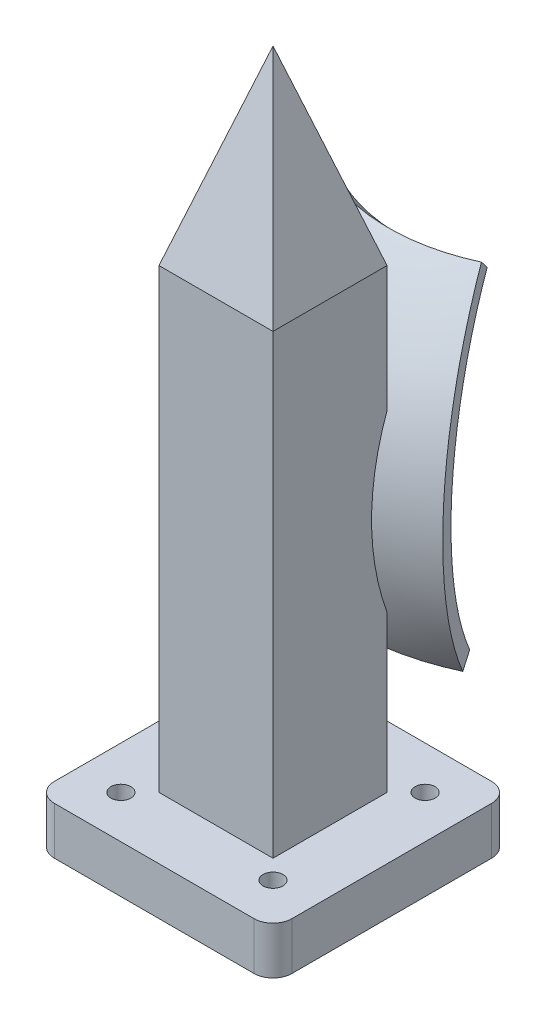
ISO-10303-21;
HEADER;
FILE_DESCRIPTION(('STEP AP214'),'2;1');
FILE_NAME('part.step','',(''),(''),'','','');
FILE_SCHEMA(('AUTOMOTIVE_DESIGN { 1 0 10303 214 1 1 1 1 }'));
ENDSEC;
DATA;
#1=APPLICATION_CONTEXT('core data for automotive mechanical design processes');
#2=APPLICATION_PROTOCOL_DEFINITION('international standard','automotive_design',2000,#1);
#3=PRODUCT_CONTEXT('',#1,'mechanical');
#4=PRODUCT('Part','Part','',(#3));
#5=PRODUCT_RELATED_PRODUCT_CATEGORY('part','',(#4));
#6=PRODUCT_DEFINITION_FORMATION('','',#4);
#7=PRODUCT_DEFINITION_CONTEXT('part definition',#1,'design');
#8=PRODUCT_DEFINITION('design','',#6,#7);
#9=PRODUCT_DEFINITION_SHAPE('','',#8);
#10=(LENGTH_UNIT() NAMED_UNIT(*) SI_UNIT(.MILLI.,.METRE.));
#11=(NAMED_UNIT(*) PLANE_ANGLE_UNIT() SI_UNIT($,.RADIAN.));
#12=(NAMED_UNIT(*) SI_UNIT($,.STERADIAN.) SOLID_ANGLE_UNIT());
#13=UNCERTAINTY_MEASURE_WITH_UNIT(LENGTH_MEASURE(1.E-05),#10,'distance_accuracy_value','');
#14=(GEOMETRIC_REPRESENTATION_CONTEXT(3) GLOBAL_UNCERTAINTY_ASSIGNED_CONTEXT((#13)) GLOBAL_UNIT_ASSIGNED_CONTEXT((#10,
#11,#12)) REPRESENTATION_CONTEXT('',''));
#15=CARTESIAN_POINT('',(0.,0.,0.));
#16=DIRECTION('',(0.,0.,1.));
#17=DIRECTION('',(1.,0.,0.));
#18=AXIS2_PLACEMENT_3D('',#15,#16,#17);
#19=CARTESIAN_POINT('',(18.5,53.,-6.5));
#20=DIRECTION('',(-1.,0.,0.));
#21=DIRECTION('',(0.,0.,1.));
#22=AXIS2_PLACEMENT_3D('',#19,#20,#21);
#23=PLANE('',#22);
#24=CARTESIAN_POINT('',(18.5,30.6059271862154,-43.6169817591008));
#25=DIRECTION('',(-1.,0.,0.));
#26=DIRECTION('',(0.,0.,1.));
#27=AXIS2_PLACEMENT_3D('',#24,#25,#26);
#28=CIRCLE('',#27,26.7452367752012);
#29=CARTESIAN_POINT('',(18.5,39.7953187588153,-18.5));
#30=VERTEX_POINT('',#29);
#31=CARTESIAN_POINT('',(18.5,21.4165356136154,-18.5));
#32=VERTEX_POINT('',#31);
#33=EDGE_CURVE('E77',#30,#32,#28,.F.);
#34=ORIENTED_EDGE('',*,*,#33,.F.);
#35=DIRECTION('',(0.,-1.,0.));
#36=VECTOR('',#35,1.);
#37=CARTESIAN_POINT('',(18.5,53.,-18.5));
#38=LINE('',#37,#36);
#39=CARTESIAN_POINT('',(18.5,53.,-18.5));
#40=VERTEX_POINT('',#39);
#41=EDGE_CURVE('E323',#40,#30,#38,.T.);
#42=ORIENTED_EDGE('',*,*,#41,.F.);
#43=DIRECTION('',(0.,0.,1.));
#44=VECTOR('',#43,1.);
#45=CARTESIAN_POINT('',(18.5,53.,-26.5));
#46=LINE('',#45,#44);
#47=CARTESIAN_POINT('',(18.5,53.,-6.5));
#48=VERTEX_POINT('',#47);
#49=EDGE_CURVE('E272',#40,#48,#46,.T.);
#50=ORIENTED_EDGE('',*,*,#49,.T.);
#51=DIRECTION('',(0.,-1.,0.));
#52=VECTOR('',#51,1.);
#53=CARTESIAN_POINT('',(18.5,53.,-6.5));
#54=LINE('',#53,#52);
#55=CARTESIAN_POINT('',(18.5,5.,-6.5));
#56=VERTEX_POINT('',#55);
#57=EDGE_CURVE('E325',#48,#56,#54,.T.);
#58=ORIENTED_EDGE('',*,*,#57,.T.);
#59=DIRECTION('',(0.,0.,-1.));
#60=VECTOR('',#59,1.);
#61=CARTESIAN_POINT('',(18.5,5.,-6.5));
#62=LINE('',#61,#60);
#63=CARTESIAN_POINT('',(18.5,5.,-18.5));
#64=VERTEX_POINT('',#63);
#65=EDGE_CURVE('E313',#56,#64,#62,.T.);
#66=ORIENTED_EDGE('',*,*,#65,.T.);
#67=EDGE_CURVE('E322',#32,#64,#38,.T.);
#68=ORIENTED_EDGE('',*,*,#67,.F.);
#69=EDGE_LOOP('',(#34,#42,#50,#58,#66,#68));
#70=FACE_BOUND('',#69,.T.);
#71=ADVANCED_FACE('F54',(#70),#23,.F.);
#72=CARTESIAN_POINT('',(6.5,53.,-18.5));
#73=DIRECTION('',(0.,0.,1.));
#74=DIRECTION('',(1.,0.,0.));
#75=AXIS2_PLACEMENT_3D('',#72,#73,#74);
#76=PLANE('',#75);
#77=CARTESIAN_POINT('',(12.5,30.6059271862154,-18.5));
#78=DIRECTION('',(0.,0.,1.));
#79=DIRECTION('',(1.,0.,0.));
#80=AXIS2_PLACEMENT_3D('',#77,#78,#79);
#81=CIRCLE('',#80,10.9747399729821);
#82=CARTESIAN_POINT('',(6.5,21.4165356136154,-18.5));
#83=VERTEX_POINT('',#82);
#84=EDGE_CURVE('E70',#32,#83,#81,.F.);
#85=ORIENTED_EDGE('',*,*,#84,.F.);
#86=ORIENTED_EDGE('',*,*,#67,.T.);
#87=DIRECTION('',(-1.,0.,0.));
#88=VECTOR('',#87,1.);
#89=CARTESIAN_POINT('',(6.5,5.,-18.5));
#90=LINE('',#89,#88);
#91=CARTESIAN_POINT('',(6.5,5.,-18.5));
#92=VERTEX_POINT('',#91);
#93=EDGE_CURVE('E316',#64,#92,#90,.T.);
#94=ORIENTED_EDGE('',*,*,#93,.T.);
#95=DIRECTION('',(0.,-1.,0.));
#96=VECTOR('',#95,1.);
#97=CARTESIAN_POINT('',(6.5,53.,-18.5));
#98=LINE('',#97,#96);
#99=EDGE_CURVE('E319',#83,#92,#98,.T.);
#100=ORIENTED_EDGE('',*,*,#99,.F.);
#101=EDGE_LOOP('',(#85,#86,#94,#100));
#102=FACE_BOUND('',#101,.T.);
#103=ADVANCED_FACE('F433',(#102),#76,.F.);
#104=CARTESIAN_POINT('',(6.5,39.7953187588153,-18.5));
#105=VERTEX_POINT('',#104);
#106=EDGE_CURVE('E220',#105,#30,#81,.F.);
#107=ORIENTED_EDGE('',*,*,#106,.F.);
#108=CARTESIAN_POINT('',(6.5,53.,-18.5));
#109=VERTEX_POINT('',#108);
#110=EDGE_CURVE('E320',#109,#105,#98,.T.);
#111=ORIENTED_EDGE('',*,*,#110,.F.);
#112=DIRECTION('',(-1.,0.,0.));
#113=VECTOR('',#112,1.);
#114=CARTESIAN_POINT('',(26.5,53.,-18.5));
#115=LINE('',#114,#113);
#116=EDGE_CURVE('E256',#40,#109,#115,.T.);
#117=ORIENTED_EDGE('',*,*,#116,.F.);
#118=ORIENTED_EDGE('',*,*,#41,.T.);
#119=EDGE_LOOP('',(#107,#111,#117,#118));
#120=FACE_BOUND('',#119,.T.);
#121=ADVANCED_FACE('F438',(#120),#76,.F.);
#122=CARTESIAN_POINT('',(6.5,53.,-6.5));
#123=DIRECTION('',(1.,0.,0.));
#124=DIRECTION('',(0.,0.,-1.));
#125=AXIS2_PLACEMENT_3D('',#122,#123,#124);
#126=PLANE('',#125);
#127=CARTESIAN_POINT('',(6.5,30.6059271862154,-43.6169817591008));
#128=DIRECTION('',(1.,0.,0.));
#129=DIRECTION('',(0.,0.,-1.));
#130=AXIS2_PLACEMENT_3D('',#127,#128,#129);
#131=CIRCLE('',#130,26.7452367752012);
#132=EDGE_CURVE('E12',#83,#105,#131,.F.);
#133=ORIENTED_EDGE('',*,*,#132,.F.);
#134=ORIENTED_EDGE('',*,*,#99,.T.);
#135=DIRECTION('',(0.,0.,1.));
#136=VECTOR('',#135,1.);
#137=CARTESIAN_POINT('',(6.5,5.,-6.5));
#138=LINE('',#137,#136);
#139=CARTESIAN_POINT('',(6.5,5.,-6.5));
#140=VERTEX_POINT('',#139);
#141=EDGE_CURVE('E307',#92,#140,#138,.T.);
#142=ORIENTED_EDGE('',*,*,#141,.T.);
#143=DIRECTION('',(0.,-1.,0.));
#144=VECTOR('',#143,1.);
#145=CARTESIAN_POINT('',(6.5,53.,-6.5));
#146=LINE('',#145,#144);
#147=CARTESIAN_POINT('',(6.5,53.,-6.5));
#148=VERTEX_POINT('',#147);
#149=EDGE_CURVE('E327',#148,#140,#146,.T.);
#150=ORIENTED_EDGE('',*,*,#149,.F.);
#151=DIRECTION('',(0.,0.,1.));
#152=VECTOR('',#151,1.);
#153=CARTESIAN_POINT('',(6.5,53.,-26.5));
#154=LINE('',#153,#152);
#155=EDGE_CURVE('E269',#109,#148,#154,.T.);
#156=ORIENTED_EDGE('',*,*,#155,.F.);
#157=ORIENTED_EDGE('',*,*,#110,.T.);
#158=EDGE_LOOP('',(#133,#134,#142,#150,#156,#157));
#159=FACE_BOUND('',#158,.T.);
#160=ADVANCED_FACE('F427',(#159),#126,.F.);
#161=CARTESIAN_POINT('',(6.5,53.,-6.5));
#162=DIRECTION('',(0.,0.,-1.));
#163=DIRECTION('',(-1.,0.,0.));
#164=AXIS2_PLACEMENT_3D('',#161,#162,#163);
#165=PLANE('',#164);
#166=DIRECTION('',(-1.,0.,0.));
#167=VECTOR('',#166,1.);
#168=CARTESIAN_POINT('',(26.5,53.,-6.5));
#169=LINE('',#168,#167);
#170=EDGE_CURVE('E263',#48,#148,#169,.T.);
#171=ORIENTED_EDGE('',*,*,#170,.T.);
#172=ORIENTED_EDGE('',*,*,#149,.T.);
#173=DIRECTION('',(1.,0.,0.));
#174=VECTOR('',#173,1.);
#175=CARTESIAN_POINT('',(6.5,5.,-6.5));
#176=LINE('',#175,#174);
#177=EDGE_CURVE('E310',#140,#56,#176,.T.);
#178=ORIENTED_EDGE('',*,*,#177,.T.);
#179=ORIENTED_EDGE('',*,*,#57,.F.);
#180=EDGE_LOOP('',(#171,#172,#178,#179));
#181=FACE_BOUND('',#180,.T.);
#182=ADVANCED_FACE('F420',(#181),#165,.F.);
#183=CARTESIAN_POINT('',(31.5596330275229,9.46788990825688,-26.5));
#184=DIRECTION('',(0.957826285221151,0.287347885566345,0.));
#185=DIRECTION('',(-0.287347885566345,0.957826285221151,0.));
#186=AXIS2_PLACEMENT_3D('',#183,#184,#185);
#187=PLANE('',#186);
#188=DIRECTION('',(0.276172385369497,-0.920574617898323,-0.276172385369497));
#189=VECTOR('',#188,1.);
#190=CARTESIAN_POINT('',(31.1737288135593,10.7542372881356,-31.1737288135593));
#191=LINE('',#190,#189);
#192=CARTESIAN_POINT('',(12.5,73.,-12.5));
#193=VERTEX_POINT('',#192);
#194=EDGE_CURVE('E261',#193,#40,#191,.T.);
#195=ORIENTED_EDGE('',*,*,#194,.F.);
#196=DIRECTION('',(0.276172385369497,-0.920574617898323,0.276172385369497));
#197=VECTOR('',#196,1.);
#198=CARTESIAN_POINT('',(29.0381355932203,17.8728813559322,4.03813559322033));
#199=LINE('',#198,#197);
#200=EDGE_CURVE('E266',#193,#48,#199,.T.);
#201=ORIENTED_EDGE('',*,*,#200,.T.);
#202=ORIENTED_EDGE('',*,*,#49,.F.);
#203=EDGE_LOOP('',(#195,#201,#202));
#204=FACE_BOUND('',#203,.T.);
#205=ADVANCED_FACE('F443',(#204),#187,.T.);
#206=CARTESIAN_POINT('',(-8.62385321100917,2.58715596330275,-26.5));
#207=DIRECTION('',(0.957826285221151,-0.287347885566345,0.));
#208=DIRECTION('',(0.287347885566345,0.957826285221151,0.));
#209=AXIS2_PLACEMENT_3D('',#206,#207,#208);
#210=PLANE('',#209);
#211=DIRECTION('',(-0.276172385369497,-0.920574617898323,0.276172385369497));
#212=VECTOR('',#211,1.);
#213=CARTESIAN_POINT('',(-5.94491525423728,11.5169491525424,5.94491525423728));
#214=LINE('',#213,#212);
#215=EDGE_CURVE('E63',#193,#148,#214,.T.);
#216=ORIENTED_EDGE('',*,*,#215,.F.);
#217=DIRECTION('',(-0.276172385369497,-0.920574617898323,-0.276172385369497));
#218=VECTOR('',#217,1.);
#219=CARTESIAN_POINT('',(-8.08050847457627,4.39830508474576,-33.0805084745763));
#220=LINE('',#219,#218);
#221=EDGE_CURVE('E258',#193,#109,#220,.T.);
#222=ORIENTED_EDGE('',*,*,#221,.T.);
#223=ORIENTED_EDGE('',*,*,#155,.T.);
#224=EDGE_LOOP('',(#216,#222,#223));
#225=FACE_BOUND('',#224,.T.);
#226=ADVANCED_FACE('F424',(#225),#210,.F.);
#227=CARTESIAN_POINT('',(0.,5.,0.));
#228=DIRECTION('',(0.,-1.,0.));
#229=DIRECTION('',(0.,0.,-1.));
#230=AXIS2_PLACEMENT_3D('',#227,#228,#229);
#231=PLANE('',#230);
#232=CARTESIAN_POINT('',(4.5,5.,-20.5));
#233=DIRECTION('',(0.,1.,0.));
#234=DIRECTION('',(0.,0.,1.));
#235=AXIS2_PLACEMENT_3D('',#232,#233,#234);
#236=CIRCLE('',#235,1.05);
#237=CARTESIAN_POINT('',(4.5,5.,-19.45));
#238=VERTEX_POINT('',#237);
#239=EDGE_CURVE('E329',#238,#238,#236,.T.);
#240=ORIENTED_EDGE('',*,*,#239,.F.);
#241=EDGE_LOOP('',(#240));
#242=FACE_BOUND('',#241,.T.);
#243=CARTESIAN_POINT('',(20.5,5.,-20.5));
#244=DIRECTION('',(0.,1.,0.));
#245=DIRECTION('',(0.,0.,1.));
#246=AXIS2_PLACEMENT_3D('',#243,#244,#245);
#247=CIRCLE('',#246,1.05);
#248=CARTESIAN_POINT('',(20.5,5.,-19.45));
#249=VERTEX_POINT('',#248);
#250=EDGE_CURVE('E333',#249,#249,#247,.T.);
#251=ORIENTED_EDGE('',*,*,#250,.F.);
#252=EDGE_LOOP('',(#251));
#253=FACE_BOUND('',#252,.T.);
#254=CARTESIAN_POINT('',(20.5,5.,-4.5));
#255=DIRECTION('',(0.,1.,0.));
#256=DIRECTION('',(0.,0.,1.));
#257=AXIS2_PLACEMENT_3D('',#254,#255,#256);
#258=CIRCLE('',#257,1.05);
#259=CARTESIAN_POINT('',(20.5,5.,-3.45));
#260=VERTEX_POINT('',#259);
#261=EDGE_CURVE('E339',#260,#260,#258,.T.);
#262=ORIENTED_EDGE('',*,*,#261,.F.);
#263=EDGE_LOOP('',(#262));
#264=FACE_BOUND('',#263,.T.);
#265=CARTESIAN_POINT('',(4.5,5.,-4.5));
#266=DIRECTION('',(0.,1.,0.));
#267=DIRECTION('',(0.,0.,1.));
#268=AXIS2_PLACEMENT_3D('',#265,#266,#267);
#269=CIRCLE('',#268,1.05);
#270=CARTESIAN_POINT('',(4.5,5.,-3.45));
#271=VERTEX_POINT('',#270);
#272=EDGE_CURVE('E345',#271,#271,#269,.T.);
#273=ORIENTED_EDGE('',*,*,#272,.F.);
#274=EDGE_LOOP('',(#273));
#275=FACE_BOUND('',#274,.T.);
#276=DIRECTION('',(-1.,0.,0.));
#277=VECTOR('',#276,1.);
#278=CARTESIAN_POINT('',(0.,5.,-25.));
#279=LINE('',#278,#277);
#280=CARTESIAN_POINT('',(23.,5.,-25.));
#281=VERTEX_POINT('',#280);
#282=CARTESIAN_POINT('',(2.,5.,-25.));
#283=VERTEX_POINT('',#282);
#284=EDGE_CURVE('E364',#281,#283,#279,.T.);
#285=ORIENTED_EDGE('',*,*,#284,.T.);
#286=CARTESIAN_POINT('',(2.,5.,-23.));
#287=DIRECTION('',(0.,-1.,0.));
#288=DIRECTION('',(0.,0.,-1.));
#289=AXIS2_PLACEMENT_3D('',#286,#287,#288);
#290=CIRCLE('',#289,2.);
#291=CARTESIAN_POINT('',(0.,5.,-23.));
#292=VERTEX_POINT('',#291);
#293=EDGE_CURVE('E401',#283,#292,#290,.F.);
#294=ORIENTED_EDGE('',*,*,#293,.T.);
#295=DIRECTION('',(0.,0.,1.));
#296=VECTOR('',#295,1.);
#297=CARTESIAN_POINT('',(0.,5.,0.));
#298=LINE('',#297,#296);
#299=CARTESIAN_POINT('',(0.,5.,-2.));
#300=VERTEX_POINT('',#299);
#301=EDGE_CURVE('E354',#292,#300,#298,.T.);
#302=ORIENTED_EDGE('',*,*,#301,.T.);
#303=CARTESIAN_POINT('',(2.,5.,-2.));
#304=DIRECTION('',(0.,-1.,0.));
#305=DIRECTION('',(0.,0.,-1.));
#306=AXIS2_PLACEMENT_3D('',#303,#304,#305);
#307=CIRCLE('',#306,2.);
#308=CARTESIAN_POINT('',(2.,5.,0.));
#309=VERTEX_POINT('',#308);
#310=EDGE_CURVE('E399',#300,#309,#307,.F.);
#311=ORIENTED_EDGE('',*,*,#310,.T.);
#312=DIRECTION('',(1.,0.,0.));
#313=VECTOR('',#312,1.);
#314=CARTESIAN_POINT('',(0.,5.,0.));
#315=LINE('',#314,#313);
#316=CARTESIAN_POINT('',(23.,5.,0.));
#317=VERTEX_POINT('',#316);
#318=EDGE_CURVE('E357',#309,#317,#315,.T.);
#319=ORIENTED_EDGE('',*,*,#318,.T.);
#320=CARTESIAN_POINT('',(23.,5.,-2.));
#321=DIRECTION('',(0.,-1.,0.));
#322=DIRECTION('',(0.,0.,-1.));
#323=AXIS2_PLACEMENT_3D('',#320,#321,#322);
#324=CIRCLE('',#323,2.);
#325=CARTESIAN_POINT('',(25.,5.,-2.));
#326=VERTEX_POINT('',#325);
#327=EDGE_CURVE('E395',#317,#326,#324,.F.);
#328=ORIENTED_EDGE('',*,*,#327,.T.);
#329=DIRECTION('',(0.,0.,-1.));
#330=VECTOR('',#329,1.);
#331=CARTESIAN_POINT('',(25.,5.,0.));
#332=LINE('',#331,#330);
#333=CARTESIAN_POINT('',(25.,5.,-23.));
#334=VERTEX_POINT('',#333);
#335=EDGE_CURVE('E361',#326,#334,#332,.T.);
#336=ORIENTED_EDGE('',*,*,#335,.T.);
#337=CARTESIAN_POINT('',(23.,5.,-23.));
#338=DIRECTION('',(0.,-1.,0.));
#339=DIRECTION('',(0.,0.,-1.));
#340=AXIS2_PLACEMENT_3D('',#337,#338,#339);
#341=CIRCLE('',#340,2.);
#342=EDGE_CURVE('E397',#334,#281,#341,.F.);
#343=ORIENTED_EDGE('',*,*,#342,.T.);
#344=EDGE_LOOP('',(#285,#294,#302,#311,#319,#328,#336,#343));
#345=FACE_BOUND('',#344,.T.);
#346=ORIENTED_EDGE('',*,*,#141,.F.);
#347=ORIENTED_EDGE('',*,*,#93,.F.);
#348=ORIENTED_EDGE('',*,*,#65,.F.);
#349=ORIENTED_EDGE('',*,*,#177,.F.);
#350=EDGE_LOOP('',(#346,#347,#348,#349));
#351=FACE_BOUND('',#350,.T.);
#352=ADVANCED_FACE('F431',(#242,#253,#264,#275,#345,#351),#231,.F.);
#353=CARTESIAN_POINT('',(0.,5.,0.));
#354=DIRECTION('',(1.,0.,0.));
#355=DIRECTION('',(0.,0.,-1.));
#356=AXIS2_PLACEMENT_3D('',#353,#354,#355);
#357=PLANE('',#356);
#358=ORIENTED_EDGE('',*,*,#301,.F.);
#359=DIRECTION('',(0.,-1.,0.));
#360=VECTOR('',#359,1.);
#361=CARTESIAN_POINT('',(0.,5.,-23.));
#362=LINE('',#361,#360);
#363=CARTESIAN_POINT('',(0.,0.,-23.));
#364=VERTEX_POINT('',#363);
#365=EDGE_CURVE('E379',#292,#364,#362,.T.);
#366=ORIENTED_EDGE('',*,*,#365,.T.);
#367=DIRECTION('',(0.,0.,1.));
#368=VECTOR('',#367,1.);
#369=CARTESIAN_POINT('',(0.,0.,0.));
#370=LINE('',#369,#368);
#371=CARTESIAN_POINT('',(0.,0.,-2.));
#372=VERTEX_POINT('',#371);
#373=EDGE_CURVE('E351',#364,#372,#370,.T.);
#374=ORIENTED_EDGE('',*,*,#373,.T.);
#375=DIRECTION('',(0.,-1.,0.));
#376=VECTOR('',#375,1.);
#377=CARTESIAN_POINT('',(0.,5.,-2.));
#378=LINE('',#377,#376);
#379=EDGE_CURVE('E367',#372,#300,#378,.F.);
#380=ORIENTED_EDGE('',*,*,#379,.T.);
#381=EDGE_LOOP('',(#358,#366,#374,#380));
#382=FACE_BOUND('',#381,.T.);
#383=ADVANCED_FACE('F488',(#382),#357,.F.);
#384=CARTESIAN_POINT('',(0.,5.,0.));
#385=DIRECTION('',(0.,0.,-1.));
#386=DIRECTION('',(-1.,0.,0.));
#387=AXIS2_PLACEMENT_3D('',#384,#385,#386);
#388=PLANE('',#387);
#389=ORIENTED_EDGE('',*,*,#318,.F.);
#390=DIRECTION('',(0.,-1.,0.));
#391=VECTOR('',#390,1.);
#392=CARTESIAN_POINT('',(2.,5.,0.));
#393=LINE('',#392,#391);
#394=CARTESIAN_POINT('',(2.,0.,0.));
#395=VERTEX_POINT('',#394);
#396=EDGE_CURVE('E405',#309,#395,#393,.T.);
#397=ORIENTED_EDGE('',*,*,#396,.T.);
#398=DIRECTION('',(1.,0.,0.));
#399=VECTOR('',#398,1.);
#400=CARTESIAN_POINT('',(0.,0.,0.));
#401=LINE('',#400,#399);
#402=CARTESIAN_POINT('',(23.,0.,0.));
#403=VERTEX_POINT('',#402);
#404=EDGE_CURVE('E370',#395,#403,#401,.T.);
#405=ORIENTED_EDGE('',*,*,#404,.T.);
#406=DIRECTION('',(0.,-1.,0.));
#407=VECTOR('',#406,1.);
#408=CARTESIAN_POINT('',(23.,5.,0.));
#409=LINE('',#408,#407);
#410=EDGE_CURVE('E403',#403,#317,#409,.F.);
#411=ORIENTED_EDGE('',*,*,#410,.T.);
#412=EDGE_LOOP('',(#389,#397,#405,#411));
#413=FACE_BOUND('',#412,.T.);
#414=ADVANCED_FACE('F500',(#413),#388,.F.);
#415=CARTESIAN_POINT('',(25.,5.,0.));
#416=DIRECTION('',(-1.,0.,0.));
#417=DIRECTION('',(0.,0.,1.));
#418=AXIS2_PLACEMENT_3D('',#415,#416,#417);
#419=PLANE('',#418);
#420=DIRECTION('',(0.,0.,-1.));
#421=VECTOR('',#420,1.);
#422=CARTESIAN_POINT('',(25.,0.,0.));
#423=LINE('',#422,#421);
#424=CARTESIAN_POINT('',(25.,0.,-2.));
#425=VERTEX_POINT('',#424);
#426=CARTESIAN_POINT('',(25.,0.,-23.));
#427=VERTEX_POINT('',#426);
#428=EDGE_CURVE('E373',#425,#427,#423,.T.);
#429=ORIENTED_EDGE('',*,*,#428,.T.);
#430=DIRECTION('',(0.,-1.,0.));
#431=VECTOR('',#430,1.);
#432=CARTESIAN_POINT('',(25.,5.,-23.));
#433=LINE('',#432,#431);
#434=EDGE_CURVE('E411',#427,#334,#433,.F.);
#435=ORIENTED_EDGE('',*,*,#434,.T.);
#436=ORIENTED_EDGE('',*,*,#335,.F.);
#437=DIRECTION('',(0.,-1.,0.));
#438=VECTOR('',#437,1.);
#439=CARTESIAN_POINT('',(25.,5.,-2.));
#440=LINE('',#439,#438);
#441=EDGE_CURVE('E408',#326,#425,#440,.T.);
#442=ORIENTED_EDGE('',*,*,#441,.T.);
#443=EDGE_LOOP('',(#429,#435,#436,#442));
#444=FACE_BOUND('',#443,.T.);
#445=ADVANCED_FACE('F496',(#444),#419,.F.);
#446=CARTESIAN_POINT('',(0.,5.,-25.));
#447=DIRECTION('',(0.,0.,1.));
#448=DIRECTION('',(1.,0.,0.));
#449=AXIS2_PLACEMENT_3D('',#446,#447,#448);
#450=PLANE('',#449);
#451=DIRECTION('',(-1.,0.,0.));
#452=VECTOR('',#451,1.);
#453=CARTESIAN_POINT('',(0.,0.,-25.));
#454=LINE('',#453,#452);
#455=CARTESIAN_POINT('',(23.,0.,-25.));
#456=VERTEX_POINT('',#455);
#457=CARTESIAN_POINT('',(2.,0.,-25.));
#458=VERTEX_POINT('',#457);
#459=EDGE_CURVE('E358',#456,#458,#454,.T.);
#460=ORIENTED_EDGE('',*,*,#459,.T.);
#461=DIRECTION('',(0.,-1.,0.));
#462=VECTOR('',#461,1.);
#463=CARTESIAN_POINT('',(2.,5.,-25.));
#464=LINE('',#463,#462);
#465=EDGE_CURVE('E393',#458,#283,#464,.F.);
#466=ORIENTED_EDGE('',*,*,#465,.T.);
#467=ORIENTED_EDGE('',*,*,#284,.F.);
#468=DIRECTION('',(0.,-1.,0.));
#469=VECTOR('',#468,1.);
#470=CARTESIAN_POINT('',(23.,5.,-25.));
#471=LINE('',#470,#469);
#472=EDGE_CURVE('E390',#281,#456,#471,.T.);
#473=ORIENTED_EDGE('',*,*,#472,.T.);
#474=EDGE_LOOP('',(#460,#466,#467,#473));
#475=FACE_BOUND('',#474,.T.);
#476=ADVANCED_FACE('F492',(#475),#450,.F.);
#477=CARTESIAN_POINT('',(0.,0.,0.));
#478=DIRECTION('',(0.,-1.,0.));
#479=DIRECTION('',(0.,0.,-1.));
#480=AXIS2_PLACEMENT_3D('',#477,#478,#479);
#481=PLANE('',#480);
#482=DIRECTION('',(0.,0.,1.));
#483=VECTOR('',#482,1.);
#484=CARTESIAN_POINT('',(15.5,0.,-9.50000000000001));
#485=LINE('',#484,#483);
#486=CARTESIAN_POINT('',(15.5,0.,-15.5));
#487=VERTEX_POINT('',#486);
#488=CARTESIAN_POINT('',(15.5,0.,-9.50000000000001));
#489=VERTEX_POINT('',#488);
#490=EDGE_CURVE('E275',#487,#489,#485,.T.);
#491=ORIENTED_EDGE('',*,*,#490,.F.);
#492=DIRECTION('',(1.,0.,0.));
#493=VECTOR('',#492,1.);
#494=CARTESIAN_POINT('',(9.5,0.,-15.5));
#495=LINE('',#494,#493);
#496=CARTESIAN_POINT('',(9.5,0.,-15.5));
#497=VERTEX_POINT('',#496);
#498=EDGE_CURVE('E284',#497,#487,#495,.T.);
#499=ORIENTED_EDGE('',*,*,#498,.F.);
#500=DIRECTION('',(0.,0.,-1.));
#501=VECTOR('',#500,1.);
#502=CARTESIAN_POINT('',(9.5,0.,-9.50000000000001));
#503=LINE('',#502,#501);
#504=CARTESIAN_POINT('',(9.5,0.,-9.50000000000001));
#505=VERTEX_POINT('',#504);
#506=EDGE_CURVE('E281',#505,#497,#503,.T.);
#507=ORIENTED_EDGE('',*,*,#506,.F.);
#508=DIRECTION('',(-1.,0.,0.));
#509=VECTOR('',#508,1.);
#510=CARTESIAN_POINT('',(9.5,0.,-9.50000000000001));
#511=LINE('',#510,#509);
#512=EDGE_CURVE('E278',#489,#505,#511,.T.);
#513=ORIENTED_EDGE('',*,*,#512,.F.);
#514=EDGE_LOOP('',(#491,#499,#507,#513));
#515=FACE_BOUND('',#514,.T.);
#516=CARTESIAN_POINT('',(4.5,0.,-20.5));
#517=DIRECTION('',(0.,1.,0.));
#518=DIRECTION('',(0.,0.,1.));
#519=AXIS2_PLACEMENT_3D('',#516,#517,#518);
#520=CIRCLE('',#519,1.05);
#521=CARTESIAN_POINT('',(4.5,0.,-19.45));
#522=VERTEX_POINT('',#521);
#523=EDGE_CURVE('E330',#522,#522,#520,.T.);
#524=ORIENTED_EDGE('',*,*,#523,.T.);
#525=EDGE_LOOP('',(#524));
#526=FACE_BOUND('',#525,.T.);
#527=CARTESIAN_POINT('',(20.5,0.,-20.5));
#528=DIRECTION('',(0.,1.,0.));
#529=DIRECTION('',(0.,0.,1.));
#530=AXIS2_PLACEMENT_3D('',#527,#528,#529);
#531=CIRCLE('',#530,1.05);
#532=CARTESIAN_POINT('',(20.5,0.,-19.45));
#533=VERTEX_POINT('',#532);
#534=EDGE_CURVE('E336',#533,#533,#531,.T.);
#535=ORIENTED_EDGE('',*,*,#534,.T.);
#536=EDGE_LOOP('',(#535));
#537=FACE_BOUND('',#536,.T.);
#538=CARTESIAN_POINT('',(20.5,0.,-4.5));
#539=DIRECTION('',(0.,1.,0.));
#540=DIRECTION('',(0.,0.,1.));
#541=AXIS2_PLACEMENT_3D('',#538,#539,#540);
#542=CIRCLE('',#541,1.05);
#543=CARTESIAN_POINT('',(20.5,0.,-3.45));
#544=VERTEX_POINT('',#543);
#545=EDGE_CURVE('E342',#544,#544,#542,.T.);
#546=ORIENTED_EDGE('',*,*,#545,.T.);
#547=EDGE_LOOP('',(#546));
#548=FACE_BOUND('',#547,.T.);
#549=CARTESIAN_POINT('',(4.5,0.,-4.5));
#550=DIRECTION('',(0.,1.,0.));
#551=DIRECTION('',(0.,0.,1.));
#552=AXIS2_PLACEMENT_3D('',#549,#550,#551);
#553=CIRCLE('',#552,1.05);
#554=CARTESIAN_POINT('',(4.5,0.,-3.45));
#555=VERTEX_POINT('',#554);
#556=EDGE_CURVE('E348',#555,#555,#553,.T.);
#557=ORIENTED_EDGE('',*,*,#556,.T.);
#558=EDGE_LOOP('',(#557));
#559=FACE_BOUND('',#558,.T.);
#560=ORIENTED_EDGE('',*,*,#373,.F.);
#561=CARTESIAN_POINT('',(2.,0.,-23.));
#562=DIRECTION('',(0.,-1.,0.));
#563=DIRECTION('',(0.,0.,-1.));
#564=AXIS2_PLACEMENT_3D('',#561,#562,#563);
#565=CIRCLE('',#564,2.);
#566=EDGE_CURVE('E388',#364,#458,#565,.T.);
#567=ORIENTED_EDGE('',*,*,#566,.T.);
#568=ORIENTED_EDGE('',*,*,#459,.F.);
#569=CARTESIAN_POINT('',(23.,0.,-23.));
#570=DIRECTION('',(0.,-1.,0.));
#571=DIRECTION('',(0.,0.,-1.));
#572=AXIS2_PLACEMENT_3D('',#569,#570,#571);
#573=CIRCLE('',#572,2.);
#574=EDGE_CURVE('E384',#456,#427,#573,.T.);
#575=ORIENTED_EDGE('',*,*,#574,.T.);
#576=ORIENTED_EDGE('',*,*,#428,.F.);
#577=CARTESIAN_POINT('',(23.,0.,-2.));
#578=DIRECTION('',(0.,-1.,0.));
#579=DIRECTION('',(0.,0.,-1.));
#580=AXIS2_PLACEMENT_3D('',#577,#578,#579);
#581=CIRCLE('',#580,2.);
#582=EDGE_CURVE('E382',#425,#403,#581,.T.);
#583=ORIENTED_EDGE('',*,*,#582,.T.);
#584=ORIENTED_EDGE('',*,*,#404,.F.);
#585=CARTESIAN_POINT('',(2.,0.,-2.));
#586=DIRECTION('',(0.,-1.,0.));
#587=DIRECTION('',(0.,0.,-1.));
#588=AXIS2_PLACEMENT_3D('',#585,#586,#587);
#589=CIRCLE('',#588,2.);
#590=EDGE_CURVE('E386',#395,#372,#589,.T.);
#591=ORIENTED_EDGE('',*,*,#590,.T.);
#592=EDGE_LOOP('',(#560,#567,#568,#575,#576,#583,#584,#591));
#593=FACE_BOUND('',#592,.T.);
#594=ADVANCED_FACE('F484',(#515,#526,#537,#548,#559,#593),#481,.T.);
#595=CARTESIAN_POINT('',(4.5,0.,-4.5));
#596=DIRECTION('',(0.,1.,0.));
#597=DIRECTION('',(0.,0.,1.));
#598=AXIS2_PLACEMENT_3D('',#595,#596,#597);
#599=CYLINDRICAL_SURFACE('',#598,1.05);
#600=ORIENTED_EDGE('',*,*,#556,.F.);
#601=EDGE_LOOP('',(#600));
#602=FACE_BOUND('',#601,.T.);
#603=ORIENTED_EDGE('',*,*,#272,.T.);
#604=EDGE_LOOP('',(#603));
#605=FACE_BOUND('',#604,.T.);
#606=ADVANCED_FACE('F480',(#602,#605),#599,.F.);
#607=CARTESIAN_POINT('',(20.5,0.,-4.5));
#608=DIRECTION('',(0.,1.,0.));
#609=DIRECTION('',(0.,0.,1.));
#610=AXIS2_PLACEMENT_3D('',#607,#608,#609);
#611=CYLINDRICAL_SURFACE('',#610,1.05);
#612=ORIENTED_EDGE('',*,*,#545,.F.);
#613=EDGE_LOOP('',(#612));
#614=FACE_BOUND('',#613,.T.);
#615=ORIENTED_EDGE('',*,*,#261,.T.);
#616=EDGE_LOOP('',(#615));
#617=FACE_BOUND('',#616,.T.);
#618=ADVANCED_FACE('F476',(#614,#617),#611,.F.);
#619=CARTESIAN_POINT('',(20.5,0.,-20.5));
#620=DIRECTION('',(0.,1.,0.));
#621=DIRECTION('',(0.,0.,1.));
#622=AXIS2_PLACEMENT_3D('',#619,#620,#621);
#623=CYLINDRICAL_SURFACE('',#622,1.05);
#624=ORIENTED_EDGE('',*,*,#534,.F.);
#625=EDGE_LOOP('',(#624));
#626=FACE_BOUND('',#625,.T.);
#627=ORIENTED_EDGE('',*,*,#250,.T.);
#628=EDGE_LOOP('',(#627));
#629=FACE_BOUND('',#628,.T.);
#630=ADVANCED_FACE('F472',(#626,#629),#623,.F.);
#631=CARTESIAN_POINT('',(4.5,0.,-20.5));
#632=DIRECTION('',(0.,1.,0.));
#633=DIRECTION('',(0.,0.,1.));
#634=AXIS2_PLACEMENT_3D('',#631,#632,#633);
#635=CYLINDRICAL_SURFACE('',#634,1.05);
#636=ORIENTED_EDGE('',*,*,#523,.F.);
#637=EDGE_LOOP('',(#636));
#638=FACE_BOUND('',#637,.T.);
#639=ORIENTED_EDGE('',*,*,#239,.T.);
#640=EDGE_LOOP('',(#639));
#641=FACE_BOUND('',#640,.T.);
#642=ADVANCED_FACE('F468',(#638,#641),#635,.F.);
#643=CARTESIAN_POINT('',(2.,5.,-23.));
#644=DIRECTION('',(0.,-1.,0.));
#645=DIRECTION('',(0.,0.,-1.));
#646=AXIS2_PLACEMENT_3D('',#643,#644,#645);
#647=CYLINDRICAL_SURFACE('',#646,2.);
#648=ORIENTED_EDGE('',*,*,#293,.F.);
#649=ORIENTED_EDGE('',*,*,#465,.F.);
#650=ORIENTED_EDGE('',*,*,#566,.F.);
#651=ORIENTED_EDGE('',*,*,#365,.F.);
#652=EDGE_LOOP('',(#648,#649,#650,#651));
#653=FACE_BOUND('',#652,.T.);
#654=ADVANCED_FACE('F471',(#653),#647,.T.);
#655=CARTESIAN_POINT('',(2.,5.,-2.));
#656=DIRECTION('',(0.,-1.,0.));
#657=DIRECTION('',(0.,0.,-1.));
#658=AXIS2_PLACEMENT_3D('',#655,#656,#657);
#659=CYLINDRICAL_SURFACE('',#658,2.);
#660=ORIENTED_EDGE('',*,*,#310,.F.);
#661=ORIENTED_EDGE('',*,*,#379,.F.);
#662=ORIENTED_EDGE('',*,*,#590,.F.);
#663=ORIENTED_EDGE('',*,*,#396,.F.);
#664=EDGE_LOOP('',(#660,#661,#662,#663));
#665=FACE_BOUND('',#664,.T.);
#666=ADVANCED_FACE('F510',(#665),#659,.T.);
#667=CARTESIAN_POINT('',(23.,5.,-23.));
#668=DIRECTION('',(0.,-1.,0.));
#669=DIRECTION('',(0.,0.,-1.));
#670=AXIS2_PLACEMENT_3D('',#667,#668,#669);
#671=CYLINDRICAL_SURFACE('',#670,2.);
#672=ORIENTED_EDGE('',*,*,#342,.F.);
#673=ORIENTED_EDGE('',*,*,#434,.F.);
#674=ORIENTED_EDGE('',*,*,#574,.F.);
#675=ORIENTED_EDGE('',*,*,#472,.F.);
#676=EDGE_LOOP('',(#672,#673,#674,#675));
#677=FACE_BOUND('',#676,.T.);
#678=ADVANCED_FACE('F513',(#677),#671,.T.);
#679=CARTESIAN_POINT('',(23.,5.,-2.));
#680=DIRECTION('',(0.,-1.,0.));
#681=DIRECTION('',(0.,0.,-1.));
#682=AXIS2_PLACEMENT_3D('',#679,#680,#681);
#683=CYLINDRICAL_SURFACE('',#682,2.);
#684=ORIENTED_EDGE('',*,*,#327,.F.);
#685=ORIENTED_EDGE('',*,*,#410,.F.);
#686=ORIENTED_EDGE('',*,*,#582,.F.);
#687=ORIENTED_EDGE('',*,*,#441,.F.);
#688=EDGE_LOOP('',(#684,#685,#686,#687));
#689=FACE_BOUND('',#688,.T.);
#690=ADVANCED_FACE('F56',(#689),#683,.T.);
#691=CARTESIAN_POINT('',(15.5,53.,-15.5));
#692=DIRECTION('',(-1.,0.,0.));
#693=DIRECTION('',(0.,0.,1.));
#694=AXIS2_PLACEMENT_3D('',#691,#692,#693);
#695=PLANE('',#694);
#696=ORIENTED_EDGE('',*,*,#490,.T.);
#697=DIRECTION('',(0.,-1.,0.));
#698=VECTOR('',#697,1.);
#699=CARTESIAN_POINT('',(15.5,53.,-9.5));
#700=LINE('',#699,#698);
#701=CARTESIAN_POINT('',(15.5,53.,-9.5));
#702=VERTEX_POINT('',#701);
#703=EDGE_CURVE('E299',#702,#489,#700,.T.);
#704=ORIENTED_EDGE('',*,*,#703,.F.);
#705=DIRECTION('',(0.,0.,-1.));
#706=VECTOR('',#705,1.);
#707=CARTESIAN_POINT('',(15.5,53.,-15.5));
#708=LINE('',#707,#706);
#709=CARTESIAN_POINT('',(15.5,53.,-15.5));
#710=VERTEX_POINT('',#709);
#711=EDGE_CURVE('E287',#702,#710,#708,.T.);
#712=ORIENTED_EDGE('',*,*,#711,.T.);
#713=DIRECTION('',(0.,-1.,0.));
#714=VECTOR('',#713,1.);
#715=CARTESIAN_POINT('',(15.5,53.,-15.5));
#716=LINE('',#715,#714);
#717=EDGE_CURVE('E305',#710,#487,#716,.T.);
#718=ORIENTED_EDGE('',*,*,#717,.T.);
#719=EDGE_LOOP('',(#696,#704,#712,#718));
#720=FACE_BOUND('',#719,.T.);
#721=ADVANCED_FACE('F520',(#720),#695,.T.);
#722=CARTESIAN_POINT('',(9.5,53.,-15.5));
#723=DIRECTION('',(0.,0.,1.));
#724=DIRECTION('',(1.,0.,0.));
#725=AXIS2_PLACEMENT_3D('',#722,#723,#724);
#726=PLANE('',#725);
#727=ORIENTED_EDGE('',*,*,#498,.T.);
#728=ORIENTED_EDGE('',*,*,#717,.F.);
#729=DIRECTION('',(-1.,0.,0.));
#730=VECTOR('',#729,1.);
#731=CARTESIAN_POINT('',(9.5,53.,-15.5));
#732=LINE('',#731,#730);
#733=CARTESIAN_POINT('',(9.5,53.,-15.5));
#734=VERTEX_POINT('',#733);
#735=EDGE_CURVE('E290',#710,#734,#732,.T.);
#736=ORIENTED_EDGE('',*,*,#735,.T.);
#737=DIRECTION('',(0.,-1.,0.));
#738=VECTOR('',#737,1.);
#739=CARTESIAN_POINT('',(9.5,53.,-15.5));
#740=LINE('',#739,#738);
#741=EDGE_CURVE('E303',#734,#497,#740,.T.);
#742=ORIENTED_EDGE('',*,*,#741,.T.);
#743=EDGE_LOOP('',(#727,#728,#736,#742));
#744=FACE_BOUND('',#743,.T.);
#745=ADVANCED_FACE('F547',(#744),#726,.T.);
#746=CARTESIAN_POINT('',(9.5,53.,-15.5));
#747=DIRECTION('',(1.,0.,0.));
#748=DIRECTION('',(0.,0.,-1.));
#749=AXIS2_PLACEMENT_3D('',#746,#747,#748);
#750=PLANE('',#749);
#751=ORIENTED_EDGE('',*,*,#506,.T.);
#752=ORIENTED_EDGE('',*,*,#741,.F.);
#753=DIRECTION('',(0.,0.,1.));
#754=VECTOR('',#753,1.);
#755=CARTESIAN_POINT('',(9.5,53.,-15.5));
#756=LINE('',#755,#754);
#757=CARTESIAN_POINT('',(9.5,53.,-9.5));
#758=VERTEX_POINT('',#757);
#759=EDGE_CURVE('E293',#734,#758,#756,.T.);
#760=ORIENTED_EDGE('',*,*,#759,.T.);
#761=DIRECTION('',(0.,-1.,0.));
#762=VECTOR('',#761,1.);
#763=CARTESIAN_POINT('',(9.5,53.,-9.5));
#764=LINE('',#763,#762);
#765=EDGE_CURVE('E301',#758,#505,#764,.T.);
#766=ORIENTED_EDGE('',*,*,#765,.T.);
#767=EDGE_LOOP('',(#751,#752,#760,#766));
#768=FACE_BOUND('',#767,.T.);
#769=ADVANCED_FACE('F552',(#768),#750,.T.);
#770=CARTESIAN_POINT('',(9.5,53.,-9.5));
#771=DIRECTION('',(0.,0.,-1.));
#772=DIRECTION('',(-1.,0.,0.));
#773=AXIS2_PLACEMENT_3D('',#770,#771,#772);
#774=PLANE('',#773);
#775=ORIENTED_EDGE('',*,*,#512,.T.);
#776=ORIENTED_EDGE('',*,*,#765,.F.);
#777=DIRECTION('',(1.,0.,0.));
#778=VECTOR('',#777,1.);
#779=CARTESIAN_POINT('',(9.5,53.,-9.5));
#780=LINE('',#779,#778);
#781=EDGE_CURVE('E296',#758,#702,#780,.T.);
#782=ORIENTED_EDGE('',*,*,#781,.T.);
#783=ORIENTED_EDGE('',*,*,#703,.T.);
#784=EDGE_LOOP('',(#775,#776,#782,#783));
#785=FACE_BOUND('',#784,.T.);
#786=ADVANCED_FACE('F558',(#785),#774,.T.);
#787=CARTESIAN_POINT('',(0.,53.,0.));
#788=DIRECTION('',(0.,-1.,0.));
#789=DIRECTION('',(0.,0.,-1.));
#790=AXIS2_PLACEMENT_3D('',#787,#788,#789);
#791=PLANE('',#790);
#792=ORIENTED_EDGE('',*,*,#735,.F.);
#793=ORIENTED_EDGE('',*,*,#711,.F.);
#794=ORIENTED_EDGE('',*,*,#781,.F.);
#795=ORIENTED_EDGE('',*,*,#759,.F.);
#796=EDGE_LOOP('',(#792,#793,#794,#795));
#797=FACE_BOUND('',#796,.T.);
#798=ADVANCED_FACE('F453',(#797),#791,.T.);
#799=CARTESIAN_POINT('',(26.5,2.58715596330275,8.62385321100917));
#800=DIRECTION('',(0.,0.287347885566345,0.957826285221151));
#801=DIRECTION('',(0.,-0.957826285221151,0.287347885566345));
#802=AXIS2_PLACEMENT_3D('',#799,#800,#801);
#803=PLANE('',#802);
#804=ORIENTED_EDGE('',*,*,#215,.T.);
#805=ORIENTED_EDGE('',*,*,#170,.F.);
#806=ORIENTED_EDGE('',*,*,#200,.F.);
#807=EDGE_LOOP('',(#804,#805,#806));
#808=FACE_BOUND('',#807,.T.);
#809=ADVANCED_FACE('F416',(#808),#803,.T.);
#810=CARTESIAN_POINT('',(26.5,9.46788990825687,-31.5596330275229));
#811=DIRECTION('',(0.,-0.287347885566345,0.957826285221151));
#812=DIRECTION('',(0.,-0.957826285221151,-0.287347885566345));
#813=AXIS2_PLACEMENT_3D('',#810,#811,#812);
#814=PLANE('',#813);
#815=ORIENTED_EDGE('',*,*,#194,.T.);
#816=ORIENTED_EDGE('',*,*,#116,.T.);
#817=ORIENTED_EDGE('',*,*,#221,.F.);
#818=EDGE_LOOP('',(#815,#816,#817));
#819=FACE_BOUND('',#818,.T.);
#820=ADVANCED_FACE('F445',(#819),#814,.F.);
#821=CARTESIAN_POINT('',(12.5,30.6059271862154,-43.6169817591008));
#822=DIRECTION('',(0.,1.,0.));
#823=DIRECTION('',(-0.4226182617407,0.,0.90630778703665));
#824=AXIS2_PLACEMENT_3D('',#821,#822,#823);
#825=SPHERICAL_SURFACE('',#824,25.6199469617793);
#826=CARTESIAN_POINT('',(12.5,49.0814718555662,-43.6169817591008));
#827=DIRECTION('',(0.,1.,0.));
#828=DIRECTION('',(0.,0.,1.));
#829=AXIS2_PLACEMENT_3D('',#826,#827,#828);
#830=CIRCLE('',#829,17.7492515756357);
#831=CARTESIAN_POINT('',(4.99884215190647,49.0814718555662,-27.5306968420297));
#832=VERTEX_POINT('',#831);
#833=CARTESIAN_POINT('',(20.0011578480935,49.0814718555662,-27.5306968420297));
#834=VERTEX_POINT('',#833);
#835=EDGE_CURVE('E221',#832,#834,#830,.T.);
#836=ORIENTED_EDGE('',*,*,#835,.T.);
#837=CARTESIAN_POINT('',(12.5,30.6059271862154,-43.6169817591008));
#838=DIRECTION('',(0.90630778703665,0.,-0.4226182617407));
#839=DIRECTION('',(-0.4226182617407,0.,-0.90630778703665));
#840=AXIS2_PLACEMENT_3D('',#837,#838,#839);
#841=CIRCLE('',#840,25.6199469617793);
#842=CARTESIAN_POINT('',(21.6083862279321,16.7538154660889,-24.0839844586265));
#843=VERTEX_POINT('',#842);
#844=EDGE_CURVE('E227',#843,#834,#841,.F.);
#845=ORIENTED_EDGE('',*,*,#844,.F.);
#846=CARTESIAN_POINT('',(12.5,16.7538154660889,-43.6169817591008));
#847=DIRECTION('',(0.,1.,0.));
#848=DIRECTION('',(0.,0.,1.));
#849=AXIS2_PLACEMENT_3D('',#846,#847,#848);
#850=CIRCLE('',#849,21.5522779124973);
#851=CARTESIAN_POINT('',(3.3916137720679,16.7538154660889,-24.0839844586265));
#852=VERTEX_POINT('',#851);
#853=EDGE_CURVE('E209',#852,#843,#850,.T.);
#854=ORIENTED_EDGE('',*,*,#853,.F.);
#855=CARTESIAN_POINT('',(12.5,30.6059271862154,-43.6169817591008));
#856=DIRECTION('',(0.90630778703665,0.,0.4226182617407));
#857=DIRECTION('',(0.4226182617407,0.,-0.90630778703665));
#858=AXIS2_PLACEMENT_3D('',#855,#856,#857);
#859=CIRCLE('',#858,25.6199469617793);
#860=EDGE_CURVE('E240',#852,#832,#859,.F.);
#861=ORIENTED_EDGE('',*,*,#860,.T.);
#862=EDGE_LOOP('',(#836,#845,#854,#861));
#863=FACE_BOUND('',#862,.T.);
#864=CARTESIAN_POINT('',(12.5,30.6059271862154,-18.5));
#865=DIRECTION('',(0.,0.,1.));
#866=DIRECTION('',(1.,0.,0.));
#867=AXIS2_PLACEMENT_3D('',#864,#865,#866);
#868=CIRCLE('',#867,5.05162445529979);
#869=CARTESIAN_POINT('',(17.5516244552998,30.6059271862154,-18.5));
#870=VERTEX_POINT('',#869);
#871=EDGE_CURVE('E58',#870,#870,#868,.F.);
#872=ORIENTED_EDGE('',*,*,#871,.F.);
#873=EDGE_LOOP('',(#872));
#874=FACE_BOUND('',#873,.T.);
#875=ADVANCED_FACE('F232',(#863,#874),#825,.F.);
#876=CARTESIAN_POINT('',(12.5,30.6059271862154,-43.6169817591008));
#877=DIRECTION('',(0.,1.,0.));
#878=DIRECTION('',(-0.4226182617407,0.,0.90630778703665));
#879=AXIS2_PLACEMENT_3D('',#876,#877,#878);
#880=SPHERICAL_SURFACE('',#879,27.4099925239241);
#881=CARTESIAN_POINT('',(12.5,30.6059271862154,-43.6169817591008));
#882=DIRECTION('',(0.90630778703665,0.,0.4226182617407));
#883=DIRECTION('',(0.4226182617407,0.,-0.90630778703665));
#884=AXIS2_PLACEMENT_3D('',#881,#882,#883);
#885=CIRCLE('',#884,27.4099925239241);
#886=CARTESIAN_POINT('',(2.75521798366389,15.78597930515,-22.719229286211));
#887=VERTEX_POINT('',#886);
#888=CARTESIAN_POINT('',(4.47474214744672,50.3723436435882,-26.4067607554266));
#889=VERTEX_POINT('',#888);
#890=EDGE_CURVE('E245',#887,#889,#885,.F.);
#891=ORIENTED_EDGE('',*,*,#890,.F.);
#892=CARTESIAN_POINT('',(12.5,15.78597930515,-43.6169817591008));
#893=DIRECTION('',(0.,1.,0.));
#894=DIRECTION('',(0.,0.,1.));
#895=AXIS2_PLACEMENT_3D('',#892,#893,#894);
#896=CIRCLE('',#895,23.0581186345305);
#897=CARTESIAN_POINT('',(22.2447820163361,15.78597930515,-22.719229286211));
#898=VERTEX_POINT('',#897);
#899=EDGE_CURVE('E248',#887,#898,#896,.T.);
#900=ORIENTED_EDGE('',*,*,#899,.T.);
#901=CARTESIAN_POINT('',(12.5,30.6059271862154,-43.6169817591008));
#902=DIRECTION('',(0.90630778703665,0.,-0.4226182617407));
#903=DIRECTION('',(-0.4226182617407,0.,-0.90630778703665));
#904=AXIS2_PLACEMENT_3D('',#901,#902,#903);
#905=CIRCLE('',#904,27.4099925239241);
#906=CARTESIAN_POINT('',(20.5252578525533,50.3723436435882,-26.4067607554266));
#907=VERTEX_POINT('',#906);
#908=EDGE_CURVE('E230',#898,#907,#905,.F.);
#909=ORIENTED_EDGE('',*,*,#908,.T.);
#910=CARTESIAN_POINT('',(12.5,50.3723436435882,-43.6169817591008));
#911=DIRECTION('',(0.,1.,0.));
#912=DIRECTION('',(0.,0.,1.));
#913=AXIS2_PLACEMENT_3D('',#910,#911,#912);
#914=CIRCLE('',#913,18.9893778359186);
#915=EDGE_CURVE('E250',#889,#907,#914,.T.);
#916=ORIENTED_EDGE('',*,*,#915,.F.);
#917=EDGE_LOOP('',(#891,#900,#909,#916));
#918=FACE_BOUND('',#917,.T.);
#919=ORIENTED_EDGE('',*,*,#106,.T.);
#920=ORIENTED_EDGE('',*,*,#33,.T.);
#921=ORIENTED_EDGE('',*,*,#84,.T.);
#922=ORIENTED_EDGE('',*,*,#132,.T.);
#923=EDGE_LOOP('',(#919,#920,#921,#922));
#924=FACE_BOUND('',#923,.T.);
#925=ADVANCED_FACE('F435',(#918,#924),#880,.T.);
#926=CARTESIAN_POINT('',(12.5,15.78597930515,-43.6169817591008));
#927=DIRECTION('',(0.,-1.,0.));
#928=DIRECTION('',(0.,0.,-1.));
#929=AXIS2_PLACEMENT_3D('',#926,#927,#928);
#930=CONICAL_SURFACE('',#929,23.0581186345305,0.99955485316327);
#931=ORIENTED_EDGE('',*,*,#853,.T.);
#932=DIRECTION('',(-0.355519324123516,0.540676830470864,-0.762413650957759));
#933=VECTOR('',#932,1.);
#934=CARTESIAN_POINT('',(31.4277941285924,1.82037590153494,-3.02619626035419));
#935=LINE('',#934,#933);
#936=EDGE_CURVE('E212',#898,#843,#935,.T.);
#937=ORIENTED_EDGE('',*,*,#936,.F.);
#938=ORIENTED_EDGE('',*,*,#899,.F.);
#939=DIRECTION('',(0.355519324123516,0.540676830470864,-0.762413650957759));
#940=VECTOR('',#939,1.);
#941=CARTESIAN_POINT('',(-6.42779412859245,1.82037590153494,-3.0261962603542));
#942=LINE('',#941,#940);
#943=EDGE_CURVE('E215',#887,#852,#942,.T.);
#944=ORIENTED_EDGE('',*,*,#943,.T.);
#945=EDGE_LOOP('',(#931,#937,#938,#944));
#946=FACE_BOUND('',#945,.T.);
#947=ADVANCED_FACE('F211',(#946),#930,.F.);
#948=CARTESIAN_POINT('',(12.5,49.0814718555662,-43.6169817591008));
#949=DIRECTION('',(0.,1.,0.));
#950=DIRECTION('',(0.,0.,1.));
#951=AXIS2_PLACEMENT_3D('',#948,#949,#950);
#952=CONICAL_SURFACE('',#951,17.7492515756357,0.765351237745713);
#953=ORIENTED_EDGE('',*,*,#915,.T.);
#954=DIRECTION('',(0.292785846094217,0.721139067809677,0.627881273176294));
#955=VECTOR('',#954,1.);
#956=CARTESIAN_POINT('',(14.885119434144,36.4805376849751,-38.5020766263371));
#957=LINE('',#956,#955);
#958=EDGE_CURVE('E234',#834,#907,#957,.T.);
#959=ORIENTED_EDGE('',*,*,#958,.F.);
#960=ORIENTED_EDGE('',*,*,#835,.F.);
#961=DIRECTION('',(-0.292785846094217,0.721139067809677,0.627881273176294));
#962=VECTOR('',#961,1.);
#963=CARTESIAN_POINT('',(10.114880565856,36.4805376849751,-38.5020766263371));
#964=LINE('',#963,#962);
#965=EDGE_CURVE('E242',#832,#889,#964,.T.);
#966=ORIENTED_EDGE('',*,*,#965,.T.);
#967=EDGE_LOOP('',(#953,#959,#960,#966));
#968=FACE_BOUND('',#967,.T.);
#969=ADVANCED_FACE('F753',(#968),#952,.F.);
#970=CARTESIAN_POINT('',(-5.933333013407,0.,-4.08657154379224));
#971=DIRECTION('',(0.90630778703665,0.,0.4226182617407));
#972=DIRECTION('',(0.4226182617407,0.,-0.90630778703665));
#973=AXIS2_PLACEMENT_3D('',#970,#971,#972);
#974=PLANE('',#973);
#975=ORIENTED_EDGE('',*,*,#943,.F.);
#976=ORIENTED_EDGE('',*,*,#890,.T.);
#977=ORIENTED_EDGE('',*,*,#965,.F.);
#978=ORIENTED_EDGE('',*,*,#860,.F.);
#979=EDGE_LOOP('',(#975,#976,#977,#978));
#980=FACE_BOUND('',#979,.T.);
#981=ADVANCED_FACE('F761',(#980),#974,.F.);
#982=CARTESIAN_POINT('',(30.933333013407,0.,-4.08657154379224));
#983=DIRECTION('',(0.90630778703665,0.,-0.4226182617407));
#984=DIRECTION('',(-0.4226182617407,0.,-0.90630778703665));
#985=AXIS2_PLACEMENT_3D('',#982,#983,#984);
#986=PLANE('',#985);
#987=ORIENTED_EDGE('',*,*,#936,.T.);
#988=ORIENTED_EDGE('',*,*,#844,.T.);
#989=ORIENTED_EDGE('',*,*,#958,.T.);
#990=ORIENTED_EDGE('',*,*,#908,.F.);
#991=EDGE_LOOP('',(#987,#988,#989,#990));
#992=FACE_BOUND('',#991,.T.);
#993=ADVANCED_FACE('F225',(#992),#986,.T.);
#994=ORIENTED_EDGE('',*,*,#871,.T.);
#995=EDGE_LOOP('',(#994));
#996=FACE_BOUND('',#995,.T.);
#997=ADVANCED_FACE('F461',(#996),#76,.F.);
#998=CLOSED_SHELL('',(#71,#103,#121,#160,#182,#205,#226,#352,#383,#414,#445,#476,#594,#606,#618,
#630,#642,#654,#666,#678,#690,#721,#745,#769,#786,#798,#809,#820,#875,#925,#947,#969,#981,#993,#997));
#999=MANIFOLD_SOLID_BREP('B2',#998);
#1000=ADVANCED_BREP_SHAPE_REPRESENTATION('',(#18,#999),#14);
#1001=SHAPE_DEFINITION_REPRESENTATION(#9,#1000);
ENDSEC;
END-ISO-10303-21;
